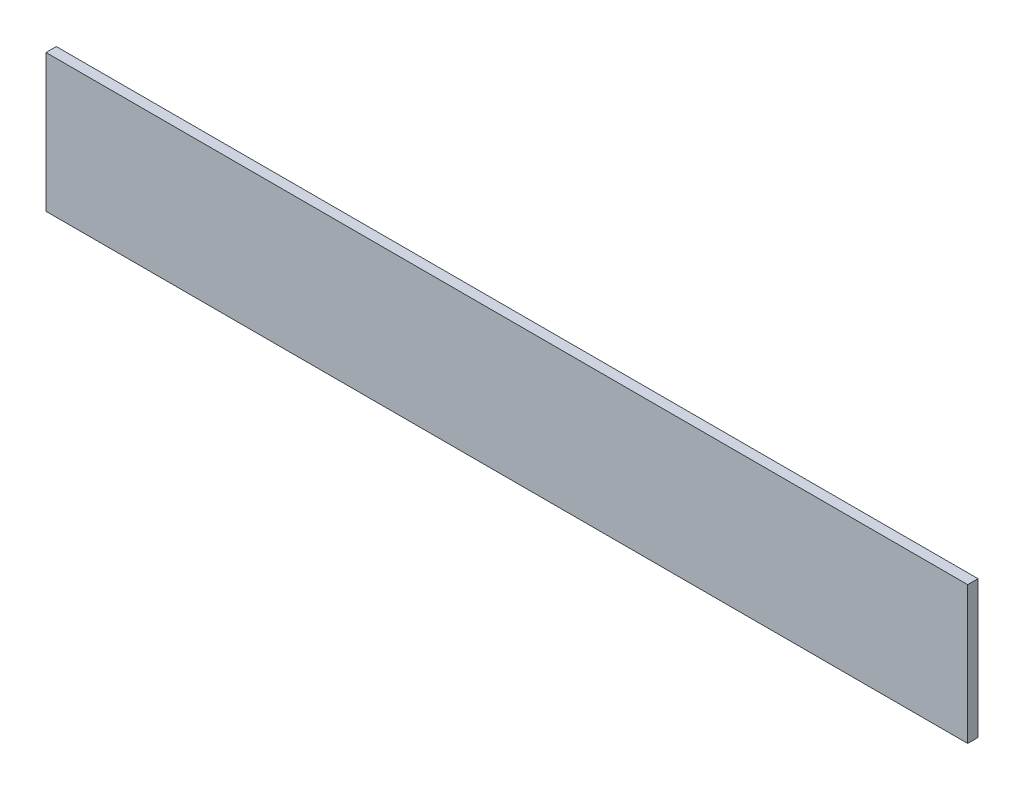
ISO-10303-21;
HEADER;
FILE_DESCRIPTION(('STEP AP214'),'2;1');
FILE_NAME('part.step','',(''),(''),'','','');
FILE_SCHEMA(('AUTOMOTIVE_DESIGN { 1 0 10303 214 1 1 1 1 }'));
ENDSEC;
DATA;
#1=APPLICATION_CONTEXT('core data for automotive mechanical design processes');
#2=APPLICATION_PROTOCOL_DEFINITION('international standard','automotive_design',2000,#1);
#3=PRODUCT_CONTEXT('',#1,'mechanical');
#4=PRODUCT('Part','Part','',(#3));
#5=PRODUCT_RELATED_PRODUCT_CATEGORY('part','',(#4));
#6=PRODUCT_DEFINITION_FORMATION('','',#4);
#7=PRODUCT_DEFINITION_CONTEXT('part definition',#1,'design');
#8=PRODUCT_DEFINITION('design','',#6,#7);
#9=PRODUCT_DEFINITION_SHAPE('','',#8);
#10=(LENGTH_UNIT() NAMED_UNIT(*) SI_UNIT(.MILLI.,.METRE.));
#11=(NAMED_UNIT(*) PLANE_ANGLE_UNIT() SI_UNIT($,.RADIAN.));
#12=(NAMED_UNIT(*) SI_UNIT($,.STERADIAN.) SOLID_ANGLE_UNIT());
#13=UNCERTAINTY_MEASURE_WITH_UNIT(LENGTH_MEASURE(1.E-05),#10,'distance_accuracy_value','');
#14=(GEOMETRIC_REPRESENTATION_CONTEXT(3) GLOBAL_UNCERTAINTY_ASSIGNED_CONTEXT((#13)) GLOBAL_UNIT_ASSIGNED_CONTEXT((#10,
#11,#12)) REPRESENTATION_CONTEXT('',''));
#15=CARTESIAN_POINT('',(0.,0.,0.));
#16=DIRECTION('',(0.,0.,1.));
#17=DIRECTION('',(1.,0.,0.));
#18=AXIS2_PLACEMENT_3D('',#15,#16,#17);
#19=CARTESIAN_POINT('',(0.,0.,4.7625));
#20=DIRECTION('',(1.,0.,0.));
#21=DIRECTION('',(0.,0.,-1.));
#22=AXIS2_PLACEMENT_3D('',#19,#20,#21);
#23=PLANE('',#22);
#24=DIRECTION('',(0.,-1.,0.));
#25=VECTOR('',#24,1.);
#26=CARTESIAN_POINT('',(0.,0.,0.));
#27=LINE('',#26,#25);
#28=CARTESIAN_POINT('',(0.,63.5,0.));
#29=VERTEX_POINT('',#28);
#30=CARTESIAN_POINT('',(0.,0.,0.));
#31=VERTEX_POINT('',#30);
#32=EDGE_CURVE('E107',#29,#31,#27,.T.);
#33=ORIENTED_EDGE('',*,*,#32,.T.);
#34=DIRECTION('',(0.,0.,-1.));
#35=VECTOR('',#34,1.);
#36=CARTESIAN_POINT('',(0.,0.,4.7625));
#37=LINE('',#36,#35);
#38=CARTESIAN_POINT('',(0.,0.,4.7625));
#39=VERTEX_POINT('',#38);
#40=EDGE_CURVE('E11',#39,#31,#37,.T.);
#41=ORIENTED_EDGE('',*,*,#40,.F.);
#42=DIRECTION('',(0.,-1.,0.));
#43=VECTOR('',#42,1.);
#44=CARTESIAN_POINT('',(0.,0.,4.7625));
#45=LINE('',#44,#43);
#46=CARTESIAN_POINT('',(0.,63.5,4.7625));
#47=VERTEX_POINT('',#46);
#48=EDGE_CURVE('E91',#47,#39,#45,.T.);
#49=ORIENTED_EDGE('',*,*,#48,.F.);
#50=DIRECTION('',(0.,0.,-1.));
#51=VECTOR('',#50,1.);
#52=CARTESIAN_POINT('',(0.,63.5,4.7625));
#53=LINE('',#52,#51);
#54=EDGE_CURVE('E103',#47,#29,#53,.T.);
#55=ORIENTED_EDGE('',*,*,#54,.T.);
#56=EDGE_LOOP('',(#33,#41,#49,#55));
#57=FACE_BOUND('',#56,.T.);
#58=ADVANCED_FACE('F39',(#57),#23,.F.);
#59=CARTESIAN_POINT('',(0.,0.,4.7625));
#60=DIRECTION('',(0.,1.,0.));
#61=DIRECTION('',(0.,0.,1.));
#62=AXIS2_PLACEMENT_3D('',#59,#60,#61);
#63=PLANE('',#62);
#64=DIRECTION('',(1.,0.,0.));
#65=VECTOR('',#64,1.);
#66=CARTESIAN_POINT('',(0.,0.,0.));
#67=LINE('',#66,#65);
#68=CARTESIAN_POINT('',(425.45,0.,0.));
#69=VERTEX_POINT('',#68);
#70=EDGE_CURVE('E96',#31,#69,#67,.T.);
#71=ORIENTED_EDGE('',*,*,#70,.T.);
#72=DIRECTION('',(0.,0.,-1.));
#73=VECTOR('',#72,1.);
#74=CARTESIAN_POINT('',(425.45,0.,4.7625));
#75=LINE('',#74,#73);
#76=CARTESIAN_POINT('',(425.45,0.,4.7625));
#77=VERTEX_POINT('',#76);
#78=EDGE_CURVE('E48',#77,#69,#75,.T.);
#79=ORIENTED_EDGE('',*,*,#78,.F.);
#80=DIRECTION('',(1.,0.,0.));
#81=VECTOR('',#80,1.);
#82=CARTESIAN_POINT('',(0.,0.,4.7625));
#83=LINE('',#82,#81);
#84=EDGE_CURVE('E86',#39,#77,#83,.T.);
#85=ORIENTED_EDGE('',*,*,#84,.F.);
#86=ORIENTED_EDGE('',*,*,#40,.T.);
#87=EDGE_LOOP('',(#71,#79,#85,#86));
#88=FACE_BOUND('',#87,.T.);
#89=ADVANCED_FACE('F95',(#88),#63,.F.);
#90=CARTESIAN_POINT('',(425.45,0.,4.7625));
#91=DIRECTION('',(-1.,0.,0.));
#92=DIRECTION('',(0.,0.,1.));
#93=AXIS2_PLACEMENT_3D('',#90,#91,#92);
#94=PLANE('',#93);
#95=DIRECTION('',(0.,1.,0.));
#96=VECTOR('',#95,1.);
#97=CARTESIAN_POINT('',(425.45,0.,0.));
#98=LINE('',#97,#96);
#99=CARTESIAN_POINT('',(425.45,63.5,0.));
#100=VERTEX_POINT('',#99);
#101=EDGE_CURVE('E73',#69,#100,#98,.T.);
#102=ORIENTED_EDGE('',*,*,#101,.T.);
#103=DIRECTION('',(0.,0.,-1.));
#104=VECTOR('',#103,1.);
#105=CARTESIAN_POINT('',(425.45,63.5,4.7625));
#106=LINE('',#105,#104);
#107=CARTESIAN_POINT('',(425.45,63.5,4.7625));
#108=VERTEX_POINT('',#107);
#109=EDGE_CURVE('E98',#108,#100,#106,.T.);
#110=ORIENTED_EDGE('',*,*,#109,.F.);
#111=DIRECTION('',(0.,1.,0.));
#112=VECTOR('',#111,1.);
#113=CARTESIAN_POINT('',(425.45,0.,4.7625));
#114=LINE('',#113,#112);
#115=EDGE_CURVE('E89',#77,#108,#114,.T.);
#116=ORIENTED_EDGE('',*,*,#115,.F.);
#117=ORIENTED_EDGE('',*,*,#78,.T.);
#118=EDGE_LOOP('',(#102,#110,#116,#117));
#119=FACE_BOUND('',#118,.T.);
#120=ADVANCED_FACE('F99',(#119),#94,.F.);
#121=CARTESIAN_POINT('',(0.,63.5,4.7625));
#122=DIRECTION('',(0.,-1.,0.));
#123=DIRECTION('',(0.,0.,-1.));
#124=AXIS2_PLACEMENT_3D('',#121,#122,#123);
#125=PLANE('',#124);
#126=DIRECTION('',(-1.,0.,0.));
#127=VECTOR('',#126,1.);
#128=CARTESIAN_POINT('',(0.,63.5,0.));
#129=LINE('',#128,#127);
#130=EDGE_CURVE('E79',#100,#29,#129,.T.);
#131=ORIENTED_EDGE('',*,*,#130,.T.);
#132=ORIENTED_EDGE('',*,*,#54,.F.);
#133=DIRECTION('',(-1.,0.,0.));
#134=VECTOR('',#133,1.);
#135=CARTESIAN_POINT('',(0.,63.5,4.7625));
#136=LINE('',#135,#134);
#137=EDGE_CURVE('E56',#108,#47,#136,.T.);
#138=ORIENTED_EDGE('',*,*,#137,.F.);
#139=ORIENTED_EDGE('',*,*,#109,.T.);
#140=EDGE_LOOP('',(#131,#132,#138,#139));
#141=FACE_BOUND('',#140,.T.);
#142=ADVANCED_FACE('F120',(#141),#125,.F.);
#143=CARTESIAN_POINT('',(0.,0.,4.7625));
#144=DIRECTION('',(0.,0.,-1.));
#145=DIRECTION('',(-1.,0.,0.));
#146=AXIS2_PLACEMENT_3D('',#143,#144,#145);
#147=PLANE('',#146);
#148=ORIENTED_EDGE('',*,*,#48,.T.);
#149=ORIENTED_EDGE('',*,*,#84,.T.);
#150=ORIENTED_EDGE('',*,*,#115,.T.);
#151=ORIENTED_EDGE('',*,*,#137,.T.);
#152=EDGE_LOOP('',(#148,#149,#150,#151));
#153=FACE_BOUND('',#152,.T.);
#154=ADVANCED_FACE('F87',(#153),#147,.F.);
#155=CARTESIAN_POINT('',(0.,0.,0.));
#156=DIRECTION('',(0.,0.,-1.));
#157=DIRECTION('',(-1.,0.,0.));
#158=AXIS2_PLACEMENT_3D('',#155,#156,#157);
#159=PLANE('',#158);
#160=ORIENTED_EDGE('',*,*,#32,.F.);
#161=ORIENTED_EDGE('',*,*,#130,.F.);
#162=ORIENTED_EDGE('',*,*,#101,.F.);
#163=ORIENTED_EDGE('',*,*,#70,.F.);
#164=EDGE_LOOP('',(#160,#161,#162,#163));
#165=FACE_BOUND('',#164,.T.);
#166=ADVANCED_FACE('F123',(#165),#159,.T.);
#167=CLOSED_SHELL('',(#58,#89,#120,#142,#154,#166));
#168=MANIFOLD_SOLID_BREP('B2',#167);
#169=ADVANCED_BREP_SHAPE_REPRESENTATION('',(#18,#168),#14);
#170=SHAPE_DEFINITION_REPRESENTATION(#9,#169);
ENDSEC;
END-ISO-10303-21;
